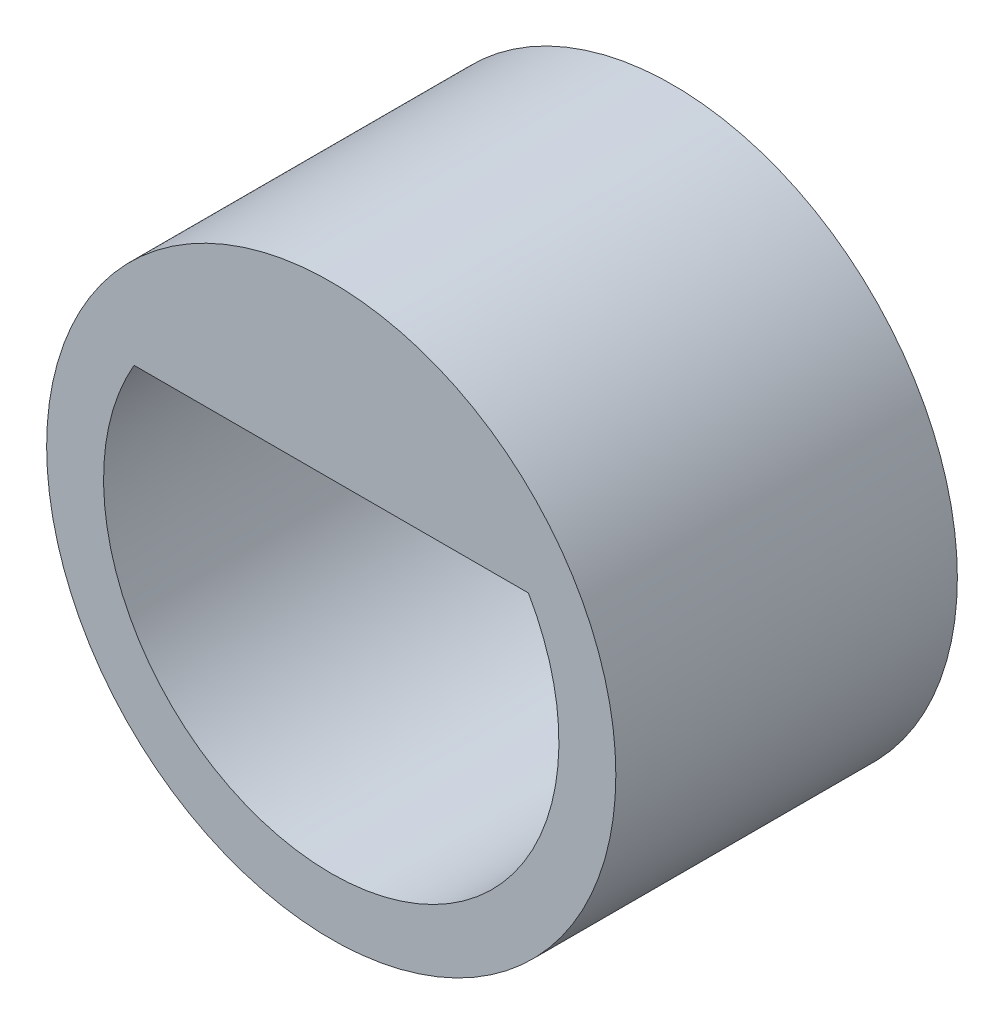
ISO-10303-21;
HEADER;
FILE_DESCRIPTION(('STEP AP214'),'2;1');
FILE_NAME('part.step','',(''),(''),'','','');
FILE_SCHEMA(('AUTOMOTIVE_DESIGN { 1 0 10303 214 1 1 1 1 }'));
ENDSEC;
DATA;
#1=APPLICATION_CONTEXT('core data for automotive mechanical design processes');
#2=APPLICATION_PROTOCOL_DEFINITION('international standard','automotive_design',2000,#1);
#3=PRODUCT_CONTEXT('',#1,'mechanical');
#4=PRODUCT('Part','Part','',(#3));
#5=PRODUCT_RELATED_PRODUCT_CATEGORY('part','',(#4));
#6=PRODUCT_DEFINITION_FORMATION('','',#4);
#7=PRODUCT_DEFINITION_CONTEXT('part definition',#1,'design');
#8=PRODUCT_DEFINITION('design','',#6,#7);
#9=PRODUCT_DEFINITION_SHAPE('','',#8);
#10=(LENGTH_UNIT() NAMED_UNIT(*) SI_UNIT(.MILLI.,.METRE.));
#11=(NAMED_UNIT(*) PLANE_ANGLE_UNIT() SI_UNIT($,.RADIAN.));
#12=(NAMED_UNIT(*) SI_UNIT($,.STERADIAN.) SOLID_ANGLE_UNIT());
#13=UNCERTAINTY_MEASURE_WITH_UNIT(LENGTH_MEASURE(1.E-05),#10,'distance_accuracy_value','');
#14=(GEOMETRIC_REPRESENTATION_CONTEXT(3) GLOBAL_UNCERTAINTY_ASSIGNED_CONTEXT((#13)) GLOBAL_UNIT_ASSIGNED_CONTEXT((#10,
#11,#12)) REPRESENTATION_CONTEXT('',''));
#15=CARTESIAN_POINT('',(0.,0.,0.));
#16=DIRECTION('',(0.,0.,1.));
#17=DIRECTION('',(1.,0.,0.));
#18=AXIS2_PLACEMENT_3D('',#15,#16,#17);
#19=CARTESIAN_POINT('',(0.,0.,3.));
#20=DIRECTION('',(0.,0.,-1.));
#21=DIRECTION('',(-1.,0.,0.));
#22=AXIS2_PLACEMENT_3D('',#19,#20,#21);
#23=CYLINDRICAL_SURFACE('',#22,2.);
#24=CARTESIAN_POINT('',(0.,0.,0.));
#25=DIRECTION('',(0.,0.,1.));
#26=DIRECTION('',(1.,0.,0.));
#27=AXIS2_PLACEMENT_3D('',#24,#25,#26);
#28=CIRCLE('',#27,2.);
#29=CARTESIAN_POINT('',(-1.73205080756888,1.,0.));
#30=VERTEX_POINT('',#29);
#31=CARTESIAN_POINT('',(1.73205080756888,1.,0.));
#32=VERTEX_POINT('',#31);
#33=EDGE_CURVE('E75',#30,#32,#28,.T.);
#34=ORIENTED_EDGE('',*,*,#33,.F.);
#35=DIRECTION('',(0.,0.,-1.));
#36=VECTOR('',#35,1.);
#37=CARTESIAN_POINT('',(-1.73205080756888,1.,3.));
#38=LINE('',#37,#36);
#39=CARTESIAN_POINT('',(-1.73205080756888,1.,3.));
#40=VERTEX_POINT('',#39);
#41=EDGE_CURVE('E11',#40,#30,#38,.T.);
#42=ORIENTED_EDGE('',*,*,#41,.F.);
#43=CARTESIAN_POINT('',(0.,0.,3.));
#44=DIRECTION('',(0.,0.,1.));
#45=DIRECTION('',(1.,0.,0.));
#46=AXIS2_PLACEMENT_3D('',#43,#44,#45);
#47=CIRCLE('',#46,2.);
#48=CARTESIAN_POINT('',(1.73205080756888,1.,3.));
#49=VERTEX_POINT('',#48);
#50=EDGE_CURVE('E76',#40,#49,#47,.T.);
#51=ORIENTED_EDGE('',*,*,#50,.T.);
#52=DIRECTION('',(0.,0.,-1.));
#53=VECTOR('',#52,1.);
#54=CARTESIAN_POINT('',(1.73205080756888,1.,3.));
#55=LINE('',#54,#53);
#56=EDGE_CURVE('E55',#49,#32,#55,.T.);
#57=ORIENTED_EDGE('',*,*,#56,.T.);
#58=EDGE_LOOP('',(#34,#42,#51,#57));
#59=FACE_BOUND('',#58,.T.);
#60=ADVANCED_FACE('F45',(#59),#23,.F.);
#61=CARTESIAN_POINT('',(0.,0.,3.));
#62=DIRECTION('',(0.,0.,-1.));
#63=DIRECTION('',(-1.,0.,0.));
#64=AXIS2_PLACEMENT_3D('',#61,#62,#63);
#65=CYLINDRICAL_SURFACE('',#64,2.5);
#66=CARTESIAN_POINT('',(0.,0.,3.));
#67=DIRECTION('',(0.,0.,1.));
#68=DIRECTION('',(1.,0.,0.));
#69=AXIS2_PLACEMENT_3D('',#66,#67,#68);
#70=CIRCLE('',#69,2.5);
#71=CARTESIAN_POINT('',(2.5,0.,3.));
#72=VERTEX_POINT('',#71);
#73=EDGE_CURVE('E82',#72,#72,#70,.T.);
#74=ORIENTED_EDGE('',*,*,#73,.F.);
#75=EDGE_LOOP('',(#74));
#76=FACE_BOUND('',#75,.T.);
#77=CARTESIAN_POINT('',(0.,0.,0.));
#78=DIRECTION('',(0.,0.,1.));
#79=DIRECTION('',(1.,0.,0.));
#80=AXIS2_PLACEMENT_3D('',#77,#78,#79);
#81=CIRCLE('',#80,2.5);
#82=CARTESIAN_POINT('',(2.5,0.,0.));
#83=VERTEX_POINT('',#82);
#84=EDGE_CURVE('E86',#83,#83,#81,.T.);
#85=ORIENTED_EDGE('',*,*,#84,.T.);
#86=EDGE_LOOP('',(#85));
#87=FACE_BOUND('',#86,.T.);
#88=ADVANCED_FACE('F47',(#76,#87),#65,.T.);
#89=CARTESIAN_POINT('',(0.,1.,3.));
#90=DIRECTION('',(0.,1.,0.));
#91=DIRECTION('',(0.,0.,1.));
#92=AXIS2_PLACEMENT_3D('',#89,#90,#91);
#93=PLANE('',#92);
#94=DIRECTION('',(1.,0.,0.));
#95=VECTOR('',#94,1.);
#96=CARTESIAN_POINT('',(0.,1.,0.));
#97=LINE('',#96,#95);
#98=EDGE_CURVE('E78',#30,#32,#97,.T.);
#99=ORIENTED_EDGE('',*,*,#98,.T.);
#100=ORIENTED_EDGE('',*,*,#56,.F.);
#101=DIRECTION('',(1.,0.,0.));
#102=VECTOR('',#101,1.);
#103=CARTESIAN_POINT('',(0.,1.,3.));
#104=LINE('',#103,#102);
#105=EDGE_CURVE('E62',#40,#49,#104,.T.);
#106=ORIENTED_EDGE('',*,*,#105,.F.);
#107=ORIENTED_EDGE('',*,*,#41,.T.);
#108=EDGE_LOOP('',(#99,#100,#106,#107));
#109=FACE_BOUND('',#108,.T.);
#110=ADVANCED_FACE('F79',(#109),#93,.F.);
#111=CARTESIAN_POINT('',(0.,0.,3.));
#112=DIRECTION('',(0.,0.,1.));
#113=DIRECTION('',(1.,0.,0.));
#114=AXIS2_PLACEMENT_3D('',#111,#112,#113);
#115=PLANE('',#114);
#116=ORIENTED_EDGE('',*,*,#73,.T.);
#117=EDGE_LOOP('',(#116));
#118=FACE_BOUND('',#117,.T.);
#119=ORIENTED_EDGE('',*,*,#50,.F.);
#120=ORIENTED_EDGE('',*,*,#105,.T.);
#121=EDGE_LOOP('',(#119,#120));
#122=FACE_BOUND('',#121,.T.);
#123=ADVANCED_FACE('F100',(#118,#122),#115,.T.);
#124=CARTESIAN_POINT('',(0.,0.,0.));
#125=DIRECTION('',(0.,0.,1.));
#126=DIRECTION('',(1.,0.,0.));
#127=AXIS2_PLACEMENT_3D('',#124,#125,#126);
#128=PLANE('',#127);
#129=ORIENTED_EDGE('',*,*,#84,.F.);
#130=EDGE_LOOP('',(#129));
#131=FACE_BOUND('',#130,.T.);
#132=ORIENTED_EDGE('',*,*,#33,.T.);
#133=ORIENTED_EDGE('',*,*,#98,.F.);
#134=EDGE_LOOP('',(#132,#133));
#135=FACE_BOUND('',#134,.T.);
#136=ADVANCED_FACE('F84',(#131,#135),#128,.F.);
#137=CLOSED_SHELL('',(#60,#88,#110,#123,#136));
#138=MANIFOLD_SOLID_BREP('B2',#137);
#139=ADVANCED_BREP_SHAPE_REPRESENTATION('',(#18,#138),#14);
#140=SHAPE_DEFINITION_REPRESENTATION(#9,#139);
ENDSEC;
END-ISO-10303-21;
